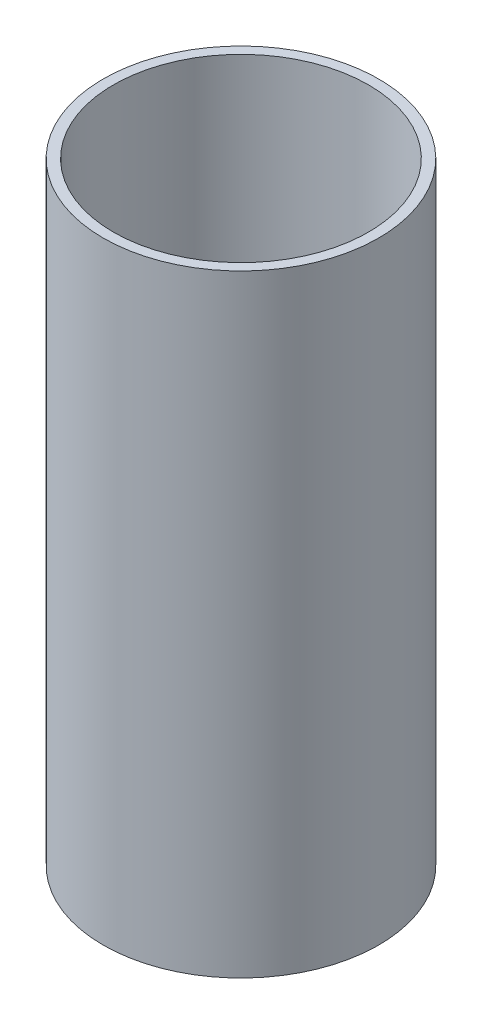
ISO-10303-21;
HEADER;
FILE_DESCRIPTION(('STEP AP214'),'2;1');
FILE_NAME('part.step','',(''),(''),'','','');
FILE_SCHEMA(('AUTOMOTIVE_DESIGN { 1 0 10303 214 1 1 1 1 }'));
ENDSEC;
DATA;
#1=APPLICATION_CONTEXT('core data for automotive mechanical design processes');
#2=APPLICATION_PROTOCOL_DEFINITION('international standard','automotive_design',2000,#1);
#3=PRODUCT_CONTEXT('',#1,'mechanical');
#4=PRODUCT('Part','Part','',(#3));
#5=PRODUCT_RELATED_PRODUCT_CATEGORY('part','',(#4));
#6=PRODUCT_DEFINITION_FORMATION('','',#4);
#7=PRODUCT_DEFINITION_CONTEXT('part definition',#1,'design');
#8=PRODUCT_DEFINITION('design','',#6,#7);
#9=PRODUCT_DEFINITION_SHAPE('','',#8);
#10=(LENGTH_UNIT() NAMED_UNIT(*) SI_UNIT(.MILLI.,.METRE.));
#11=(NAMED_UNIT(*) PLANE_ANGLE_UNIT() SI_UNIT($,.RADIAN.));
#12=(NAMED_UNIT(*) SI_UNIT($,.STERADIAN.) SOLID_ANGLE_UNIT());
#13=UNCERTAINTY_MEASURE_WITH_UNIT(LENGTH_MEASURE(1.E-05),#10,'distance_accuracy_value','');
#14=(GEOMETRIC_REPRESENTATION_CONTEXT(3) GLOBAL_UNCERTAINTY_ASSIGNED_CONTEXT((#13)) GLOBAL_UNIT_ASSIGNED_CONTEXT((#10,
#11,#12)) REPRESENTATION_CONTEXT('',''));
#15=CARTESIAN_POINT('',(0.,0.,0.));
#16=DIRECTION('',(0.,0.,1.));
#17=DIRECTION('',(1.,0.,0.));
#18=AXIS2_PLACEMENT_3D('',#15,#16,#17);
#19=CARTESIAN_POINT('',(0.,120.,0.));
#20=DIRECTION('',(0.,1.,0.));
#21=DIRECTION('',(0.,0.,1.));
#22=AXIS2_PLACEMENT_3D('',#19,#20,#21);
#23=PLANE('',#22);
#24=CARTESIAN_POINT('',(0.,120.,0.));
#25=DIRECTION('',(0.,1.,0.));
#26=DIRECTION('',(0.,0.,1.));
#27=AXIS2_PLACEMENT_3D('',#24,#25,#26);
#28=CIRCLE('',#27,27.);
#29=CARTESIAN_POINT('',(0.,120.,27.));
#30=VERTEX_POINT('',#29);
#31=EDGE_CURVE('E10',#30,#30,#28,.T.);
#32=ORIENTED_EDGE('',*,*,#31,.T.);
#33=EDGE_LOOP('',(#32));
#34=FACE_BOUND('',#33,.T.);
#35=CARTESIAN_POINT('',(0.,120.,0.));
#36=DIRECTION('',(0.,1.,0.));
#37=DIRECTION('',(0.,0.,1.));
#38=AXIS2_PLACEMENT_3D('',#35,#36,#37);
#39=CIRCLE('',#38,25.);
#40=CARTESIAN_POINT('',(0.,120.,25.));
#41=VERTEX_POINT('',#40);
#42=EDGE_CURVE('E50',#41,#41,#39,.T.);
#43=ORIENTED_EDGE('',*,*,#42,.F.);
#44=EDGE_LOOP('',(#43));
#45=FACE_BOUND('',#44,.T.);
#46=ADVANCED_FACE('F37',(#34,#45),#23,.T.);
#47=CARTESIAN_POINT('',(0.,0.,0.));
#48=DIRECTION('',(0.,1.,0.));
#49=DIRECTION('',(0.,0.,1.));
#50=AXIS2_PLACEMENT_3D('',#47,#48,#49);
#51=PLANE('',#50);
#52=CARTESIAN_POINT('',(0.,0.,0.));
#53=DIRECTION('',(0.,1.,0.));
#54=DIRECTION('',(0.,0.,1.));
#55=AXIS2_PLACEMENT_3D('',#52,#53,#54);
#56=CIRCLE('',#55,27.);
#57=CARTESIAN_POINT('',(0.,0.,27.));
#58=VERTEX_POINT('',#57);
#59=EDGE_CURVE('E41',#58,#58,#56,.T.);
#60=ORIENTED_EDGE('',*,*,#59,.F.);
#61=EDGE_LOOP('',(#60));
#62=FACE_BOUND('',#61,.T.);
#63=CARTESIAN_POINT('',(0.,0.,0.));
#64=DIRECTION('',(0.,1.,0.));
#65=DIRECTION('',(0.,0.,1.));
#66=AXIS2_PLACEMENT_3D('',#63,#64,#65);
#67=CIRCLE('',#66,25.);
#68=CARTESIAN_POINT('',(0.,0.,25.));
#69=VERTEX_POINT('',#68);
#70=EDGE_CURVE('E52',#69,#69,#67,.T.);
#71=ORIENTED_EDGE('',*,*,#70,.T.);
#72=EDGE_LOOP('',(#71));
#73=FACE_BOUND('',#72,.T.);
#74=ADVANCED_FACE('F64',(#62,#73),#51,.F.);
#75=CARTESIAN_POINT('',(0.,120.,0.));
#76=DIRECTION('',(0.,-1.,0.));
#77=DIRECTION('',(0.,0.,-1.));
#78=AXIS2_PLACEMENT_3D('',#75,#76,#77);
#79=CYLINDRICAL_SURFACE('',#78,27.);
#80=ORIENTED_EDGE('',*,*,#31,.F.);
#81=EDGE_LOOP('',(#80));
#82=FACE_BOUND('',#81,.T.);
#83=ORIENTED_EDGE('',*,*,#59,.T.);
#84=EDGE_LOOP('',(#83));
#85=FACE_BOUND('',#84,.T.);
#86=ADVANCED_FACE('F39',(#82,#85),#79,.T.);
#87=CARTESIAN_POINT('',(0.,120.,0.));
#88=DIRECTION('',(0.,-1.,0.));
#89=DIRECTION('',(0.,0.,-1.));
#90=AXIS2_PLACEMENT_3D('',#87,#88,#89);
#91=CYLINDRICAL_SURFACE('',#90,25.);
#92=ORIENTED_EDGE('',*,*,#42,.T.);
#93=EDGE_LOOP('',(#92));
#94=FACE_BOUND('',#93,.T.);
#95=ORIENTED_EDGE('',*,*,#70,.F.);
#96=EDGE_LOOP('',(#95));
#97=FACE_BOUND('',#96,.T.);
#98=ADVANCED_FACE('F60',(#94,#97),#91,.F.);
#99=CLOSED_SHELL('',(#46,#74,#86,#98));
#100=MANIFOLD_SOLID_BREP('B2',#99);
#101=ADVANCED_BREP_SHAPE_REPRESENTATION('',(#18,#100),#14);
#102=SHAPE_DEFINITION_REPRESENTATION(#9,#101);
ENDSEC;
END-ISO-10303-21;
